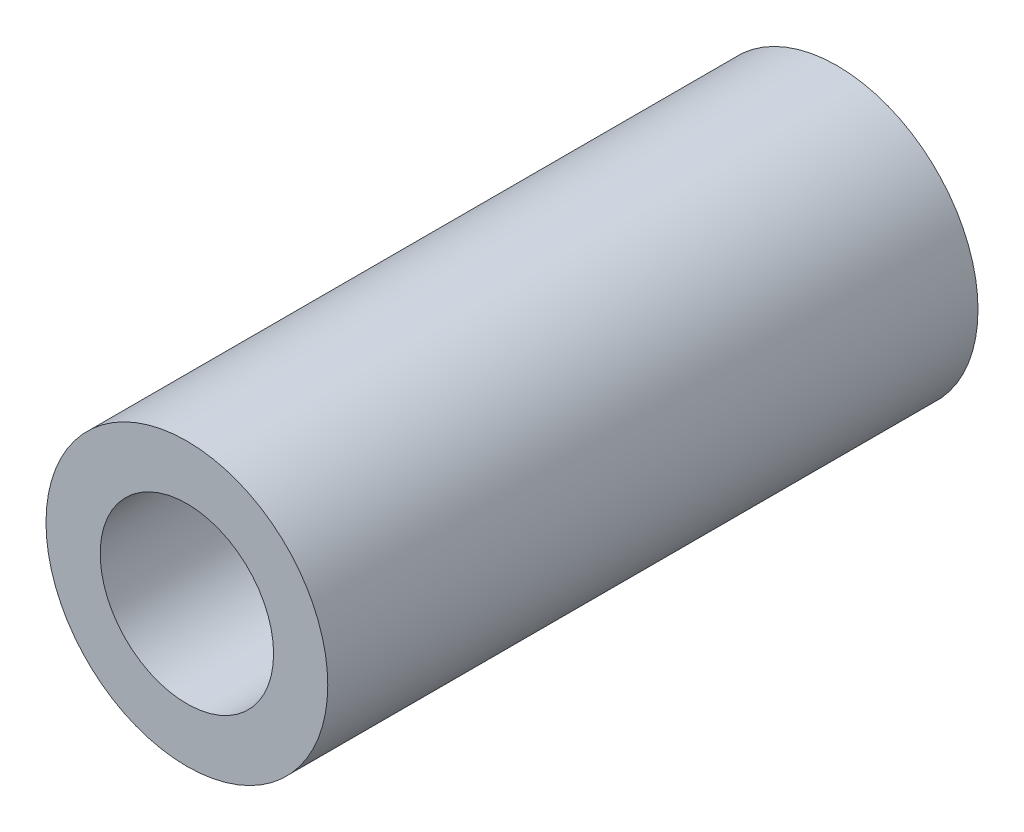
ISO-10303-21;
HEADER;
FILE_DESCRIPTION(('STEP AP214'),'2;1');
FILE_NAME('part.step','',(''),(''),'','','');
FILE_SCHEMA(('AUTOMOTIVE_DESIGN { 1 0 10303 214 1 1 1 1 }'));
ENDSEC;
DATA;
#1=APPLICATION_CONTEXT('core data for automotive mechanical design processes');
#2=APPLICATION_PROTOCOL_DEFINITION('international standard','automotive_design',2000,#1);
#3=PRODUCT_CONTEXT('',#1,'mechanical');
#4=PRODUCT('Part','Part','',(#3));
#5=PRODUCT_RELATED_PRODUCT_CATEGORY('part','',(#4));
#6=PRODUCT_DEFINITION_FORMATION('','',#4);
#7=PRODUCT_DEFINITION_CONTEXT('part definition',#1,'design');
#8=PRODUCT_DEFINITION('design','',#6,#7);
#9=PRODUCT_DEFINITION_SHAPE('','',#8);
#10=(LENGTH_UNIT() NAMED_UNIT(*) SI_UNIT(.MILLI.,.METRE.));
#11=(NAMED_UNIT(*) PLANE_ANGLE_UNIT() SI_UNIT($,.RADIAN.));
#12=(NAMED_UNIT(*) SI_UNIT($,.STERADIAN.) SOLID_ANGLE_UNIT());
#13=UNCERTAINTY_MEASURE_WITH_UNIT(LENGTH_MEASURE(1.E-05),#10,'distance_accuracy_value','');
#14=(GEOMETRIC_REPRESENTATION_CONTEXT(3) GLOBAL_UNCERTAINTY_ASSIGNED_CONTEXT((#13)) GLOBAL_UNIT_ASSIGNED_CONTEXT((#10,
#11,#12)) REPRESENTATION_CONTEXT('',''));
#15=CARTESIAN_POINT('',(0.,0.,0.));
#16=DIRECTION('',(0.,0.,1.));
#17=DIRECTION('',(1.,0.,0.));
#18=AXIS2_PLACEMENT_3D('',#15,#16,#17);
#19=CARTESIAN_POINT('',(0.,0.,12.));
#20=DIRECTION('',(0.,0.,1.));
#21=DIRECTION('',(1.,0.,0.));
#22=AXIS2_PLACEMENT_3D('',#19,#20,#21);
#23=PLANE('',#22);
#24=CARTESIAN_POINT('',(0.,0.,12.));
#25=DIRECTION('',(0.,0.,1.));
#26=DIRECTION('',(1.,0.,0.));
#27=AXIS2_PLACEMENT_3D('',#24,#25,#26);
#28=CIRCLE('',#27,2.6);
#29=CARTESIAN_POINT('',(2.6,0.,12.));
#30=VERTEX_POINT('',#29);
#31=EDGE_CURVE('E10',#30,#30,#28,.T.);
#32=ORIENTED_EDGE('',*,*,#31,.T.);
#33=EDGE_LOOP('',(#32));
#34=FACE_BOUND('',#33,.T.);
#35=CARTESIAN_POINT('',(0.,0.,12.));
#36=DIRECTION('',(0.,0.,1.));
#37=DIRECTION('',(1.,0.,0.));
#38=AXIS2_PLACEMENT_3D('',#35,#36,#37);
#39=CIRCLE('',#38,1.6);
#40=CARTESIAN_POINT('',(1.6,0.,12.));
#41=VERTEX_POINT('',#40);
#42=EDGE_CURVE('E50',#41,#41,#39,.T.);
#43=ORIENTED_EDGE('',*,*,#42,.F.);
#44=EDGE_LOOP('',(#43));
#45=FACE_BOUND('',#44,.T.);
#46=ADVANCED_FACE('F37',(#34,#45),#23,.T.);
#47=CARTESIAN_POINT('',(0.,0.,0.));
#48=DIRECTION('',(0.,0.,1.));
#49=DIRECTION('',(1.,0.,0.));
#50=AXIS2_PLACEMENT_3D('',#47,#48,#49);
#51=PLANE('',#50);
#52=CARTESIAN_POINT('',(0.,0.,0.));
#53=DIRECTION('',(0.,0.,1.));
#54=DIRECTION('',(1.,0.,0.));
#55=AXIS2_PLACEMENT_3D('',#52,#53,#54);
#56=CIRCLE('',#55,2.6);
#57=CARTESIAN_POINT('',(2.6,0.,0.));
#58=VERTEX_POINT('',#57);
#59=EDGE_CURVE('E41',#58,#58,#56,.T.);
#60=ORIENTED_EDGE('',*,*,#59,.F.);
#61=EDGE_LOOP('',(#60));
#62=FACE_BOUND('',#61,.T.);
#63=CARTESIAN_POINT('',(0.,0.,0.));
#64=DIRECTION('',(0.,0.,1.));
#65=DIRECTION('',(1.,0.,0.));
#66=AXIS2_PLACEMENT_3D('',#63,#64,#65);
#67=CIRCLE('',#66,1.6);
#68=CARTESIAN_POINT('',(1.6,0.,0.));
#69=VERTEX_POINT('',#68);
#70=EDGE_CURVE('E52',#69,#69,#67,.T.);
#71=ORIENTED_EDGE('',*,*,#70,.T.);
#72=EDGE_LOOP('',(#71));
#73=FACE_BOUND('',#72,.T.);
#74=ADVANCED_FACE('F64',(#62,#73),#51,.F.);
#75=CARTESIAN_POINT('',(0.,0.,12.));
#76=DIRECTION('',(0.,0.,-1.));
#77=DIRECTION('',(-1.,0.,0.));
#78=AXIS2_PLACEMENT_3D('',#75,#76,#77);
#79=CYLINDRICAL_SURFACE('',#78,2.6);
#80=ORIENTED_EDGE('',*,*,#31,.F.);
#81=EDGE_LOOP('',(#80));
#82=FACE_BOUND('',#81,.T.);
#83=ORIENTED_EDGE('',*,*,#59,.T.);
#84=EDGE_LOOP('',(#83));
#85=FACE_BOUND('',#84,.T.);
#86=ADVANCED_FACE('F39',(#82,#85),#79,.T.);
#87=CARTESIAN_POINT('',(0.,0.,12.));
#88=DIRECTION('',(0.,0.,-1.));
#89=DIRECTION('',(-1.,0.,0.));
#90=AXIS2_PLACEMENT_3D('',#87,#88,#89);
#91=CYLINDRICAL_SURFACE('',#90,1.6);
#92=ORIENTED_EDGE('',*,*,#42,.T.);
#93=EDGE_LOOP('',(#92));
#94=FACE_BOUND('',#93,.T.);
#95=ORIENTED_EDGE('',*,*,#70,.F.);
#96=EDGE_LOOP('',(#95));
#97=FACE_BOUND('',#96,.T.);
#98=ADVANCED_FACE('F60',(#94,#97),#91,.F.);
#99=CLOSED_SHELL('',(#46,#74,#86,#98));
#100=MANIFOLD_SOLID_BREP('B2',#99);
#101=ADVANCED_BREP_SHAPE_REPRESENTATION('',(#18,#100),#14);
#102=SHAPE_DEFINITION_REPRESENTATION(#9,#101);
ENDSEC;
END-ISO-10303-21;
